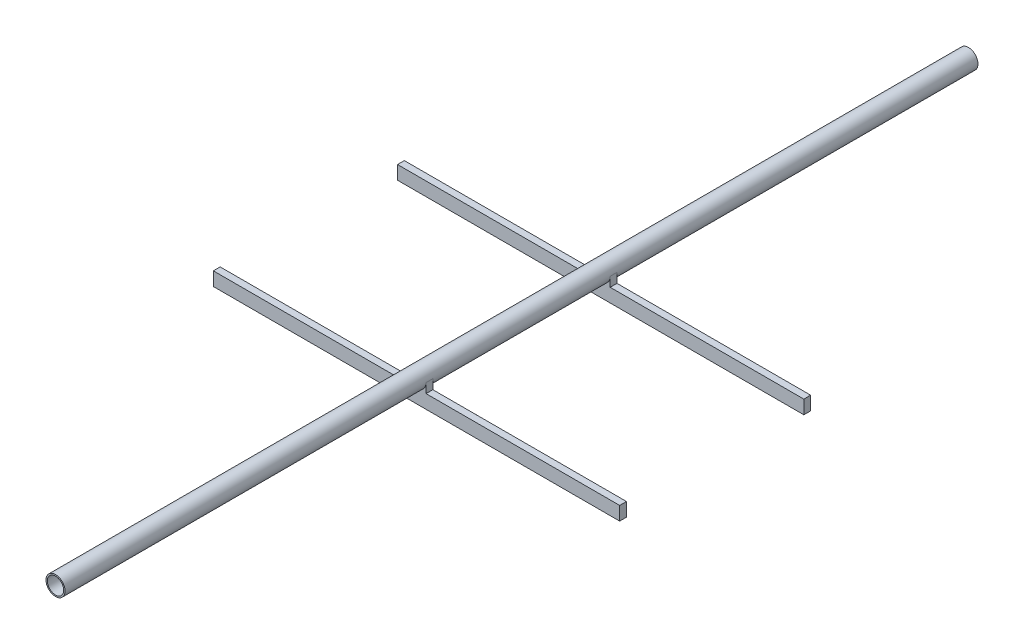
ISO-10303-21;
HEADER;
FILE_DESCRIPTION(('STEP AP214'),'2;1');
FILE_NAME('part.step','',(''),(''),'','','');
FILE_SCHEMA(('AUTOMOTIVE_DESIGN { 1 0 10303 214 1 1 1 1 }'));
ENDSEC;
DATA;
#1=APPLICATION_CONTEXT('core data for automotive mechanical design processes');
#2=APPLICATION_PROTOCOL_DEFINITION('international standard','automotive_design',2000,#1);
#3=PRODUCT_CONTEXT('',#1,'mechanical');
#4=PRODUCT('Part','Part','',(#3));
#5=PRODUCT_RELATED_PRODUCT_CATEGORY('part','',(#4));
#6=PRODUCT_DEFINITION_FORMATION('','',#4);
#7=PRODUCT_DEFINITION_CONTEXT('part definition',#1,'design');
#8=PRODUCT_DEFINITION('design','',#6,#7);
#9=PRODUCT_DEFINITION_SHAPE('','',#8);
#10=(LENGTH_UNIT() NAMED_UNIT(*) SI_UNIT(.MILLI.,.METRE.));
#11=(NAMED_UNIT(*) PLANE_ANGLE_UNIT() SI_UNIT($,.RADIAN.));
#12=(NAMED_UNIT(*) SI_UNIT($,.STERADIAN.) SOLID_ANGLE_UNIT());
#13=UNCERTAINTY_MEASURE_WITH_UNIT(LENGTH_MEASURE(1.E-05),#10,'distance_accuracy_value','');
#14=(GEOMETRIC_REPRESENTATION_CONTEXT(3) GLOBAL_UNCERTAINTY_ASSIGNED_CONTEXT((#13)) GLOBAL_UNIT_ASSIGNED_CONTEXT((#10,
#11,#12)) REPRESENTATION_CONTEXT('',''));
#15=CARTESIAN_POINT('',(0.,0.,0.));
#16=DIRECTION('',(0.,0.,1.));
#17=DIRECTION('',(1.,0.,0.));
#18=AXIS2_PLACEMENT_3D('',#15,#16,#17);
#19=CARTESIAN_POINT('',(0.,0.,-335.28));
#20=DIRECTION('',(0.,0.,1.));
#21=DIRECTION('',(1.,0.,0.));
#22=AXIS2_PLACEMENT_3D('',#19,#20,#21);
#23=CYLINDRICAL_SURFACE('',#22,7.);
#24=CARTESIAN_POINT('',(0.,0.,-335.28));
#25=DIRECTION('',(0.,0.,1.));
#26=DIRECTION('',(1.,0.,0.));
#27=AXIS2_PLACEMENT_3D('',#24,#25,#26);
#28=CIRCLE('',#27,7.);
#29=CARTESIAN_POINT('',(7.,0.,-335.28));
#30=VERTEX_POINT('',#29);
#31=EDGE_CURVE('E11',#30,#30,#28,.T.);
#32=ORIENTED_EDGE('',*,*,#31,.T.);
#33=EDGE_LOOP('',(#32));
#34=FACE_BOUND('',#33,.T.);
#35=CARTESIAN_POINT('',(0.,0.,335.28));
#36=DIRECTION('',(0.,0.,1.));
#37=DIRECTION('',(1.,0.,0.));
#38=AXIS2_PLACEMENT_3D('',#35,#36,#37);
#39=CIRCLE('',#38,7.);
#40=CARTESIAN_POINT('',(7.,0.,335.28));
#41=VERTEX_POINT('',#40);
#42=EDGE_CURVE('E337',#41,#41,#39,.T.);
#43=ORIENTED_EDGE('',*,*,#42,.F.);
#44=EDGE_LOOP('',(#43));
#45=FACE_BOUND('',#44,.T.);
#46=CARTESIAN_POINT('',(0.,0.,-70.13));
#47=DIRECTION('',(0.,0.,1.));
#48=DIRECTION('',(1.,0.,0.));
#49=AXIS2_PLACEMENT_3D('',#46,#47,#48);
#50=CIRCLE('',#49,7.);
#51=CARTESIAN_POINT('',(-7.,0.,-70.13));
#52=VERTEX_POINT('',#51);
#53=CARTESIAN_POINT('',(7.,0.,-70.13));
#54=VERTEX_POINT('',#53);
#55=EDGE_CURVE('E312',#52,#54,#50,.T.);
#56=ORIENTED_EDGE('',*,*,#55,.F.);
#57=DIRECTION('',(0.,0.,1.));
#58=VECTOR('',#57,1.);
#59=CARTESIAN_POINT('',(-7.,0.,-335.28));
#60=LINE('',#59,#58);
#61=CARTESIAN_POINT('',(-7.,0.,-65.13));
#62=VERTEX_POINT('',#61);
#63=EDGE_CURVE('E255',#52,#62,#60,.T.);
#64=ORIENTED_EDGE('',*,*,#63,.T.);
#65=CARTESIAN_POINT('',(0.,0.,-65.13));
#66=DIRECTION('',(0.,0.,-1.));
#67=DIRECTION('',(-1.,0.,0.));
#68=AXIS2_PLACEMENT_3D('',#65,#66,#67);
#69=CIRCLE('',#68,7.);
#70=CARTESIAN_POINT('',(7.,0.,-65.13));
#71=VERTEX_POINT('',#70);
#72=EDGE_CURVE('E318',#71,#62,#69,.T.);
#73=ORIENTED_EDGE('',*,*,#72,.F.);
#74=DIRECTION('',(0.,0.,1.));
#75=VECTOR('',#74,1.);
#76=CARTESIAN_POINT('',(6.99999999999996,0.,-335.28));
#77=LINE('',#76,#75);
#78=EDGE_CURVE('E316',#54,#71,#77,.T.);
#79=ORIENTED_EDGE('',*,*,#78,.F.);
#80=EDGE_LOOP('',(#56,#64,#73,#79));
#81=FACE_BOUND('',#80,.T.);
#82=DIRECTION('',(0.,0.,-1.));
#83=VECTOR('',#82,1.);
#84=CARTESIAN_POINT('',(-7.,0.,335.28));
#85=LINE('',#84,#83);
#86=CARTESIAN_POINT('',(-7.,0.,70.13));
#87=VERTEX_POINT('',#86);
#88=CARTESIAN_POINT('',(-7.,0.,65.13));
#89=VERTEX_POINT('',#88);
#90=EDGE_CURVE('E162',#87,#89,#85,.T.);
#91=ORIENTED_EDGE('',*,*,#90,.F.);
#92=CARTESIAN_POINT('',(0.,0.,70.13));
#93=DIRECTION('',(0.,0.,1.));
#94=DIRECTION('',(1.,0.,0.));
#95=AXIS2_PLACEMENT_3D('',#92,#93,#94);
#96=CIRCLE('',#95,7.);
#97=CARTESIAN_POINT('',(7.00000000000007,0.,70.13));
#98=VERTEX_POINT('',#97);
#99=EDGE_CURVE('E56',#87,#98,#96,.T.);
#100=ORIENTED_EDGE('',*,*,#99,.T.);
#101=DIRECTION('',(0.,0.,-1.));
#102=VECTOR('',#101,1.);
#103=CARTESIAN_POINT('',(6.99999999999996,0.,335.28));
#104=LINE('',#103,#102);
#105=CARTESIAN_POINT('',(7.,0.,65.13));
#106=VERTEX_POINT('',#105);
#107=EDGE_CURVE('E61',#98,#106,#104,.T.);
#108=ORIENTED_EDGE('',*,*,#107,.T.);
#109=CARTESIAN_POINT('',(0.,0.,65.13));
#110=DIRECTION('',(0.,0.,-1.));
#111=DIRECTION('',(-1.,0.,0.));
#112=AXIS2_PLACEMENT_3D('',#109,#110,#111);
#113=CIRCLE('',#112,7.);
#114=EDGE_CURVE('E218',#106,#89,#113,.T.);
#115=ORIENTED_EDGE('',*,*,#114,.T.);
#116=EDGE_LOOP('',(#91,#100,#108,#115));
#117=FACE_BOUND('',#116,.T.);
#118=ADVANCED_FACE('F41',(#34,#45,#81,#117),#23,.T.);
#119=CARTESIAN_POINT('',(0.,-7.,0.));
#120=DIRECTION('',(0.,1.,0.));
#121=DIRECTION('',(0.,0.,1.));
#122=AXIS2_PLACEMENT_3D('',#119,#120,#121);
#123=PLANE('',#122);
#124=DIRECTION('',(1.,0.,0.));
#125=VECTOR('',#124,1.);
#126=CARTESIAN_POINT('',(-149.215,-7.,-65.13));
#127=LINE('',#126,#125);
#128=CARTESIAN_POINT('',(-149.215,-7.,-65.13));
#129=VERTEX_POINT('',#128);
#130=CARTESIAN_POINT('',(-7.,-7.,-65.13));
#131=VERTEX_POINT('',#130);
#132=EDGE_CURVE('E270',#129,#131,#127,.T.);
#133=ORIENTED_EDGE('',*,*,#132,.T.);
#134=DIRECTION('',(0.,0.,1.));
#135=VECTOR('',#134,1.);
#136=CARTESIAN_POINT('',(-7.,-7.,-70.13));
#137=LINE('',#136,#135);
#138=CARTESIAN_POINT('',(-7.00000000000001,-7.,-70.13));
#139=VERTEX_POINT('',#138);
#140=EDGE_CURVE('E251',#139,#131,#137,.T.);
#141=ORIENTED_EDGE('',*,*,#140,.F.);
#142=DIRECTION('',(-1.,0.,0.));
#143=VECTOR('',#142,1.);
#144=CARTESIAN_POINT('',(149.215,-7.,-70.1300000000001));
#145=LINE('',#144,#143);
#146=CARTESIAN_POINT('',(-149.215,-7.,-70.13));
#147=VERTEX_POINT('',#146);
#148=EDGE_CURVE('E286',#139,#147,#145,.T.);
#149=ORIENTED_EDGE('',*,*,#148,.T.);
#150=DIRECTION('',(0.,0.,1.));
#151=VECTOR('',#150,1.);
#152=CARTESIAN_POINT('',(-149.215,-7.,-70.13));
#153=LINE('',#152,#151);
#154=EDGE_CURVE('E290',#147,#129,#153,.T.);
#155=ORIENTED_EDGE('',*,*,#154,.T.);
#156=EDGE_LOOP('',(#133,#141,#149,#155));
#157=FACE_BOUND('',#156,.T.);
#158=ADVANCED_FACE('F367',(#157),#123,.T.);
#159=CARTESIAN_POINT('',(0.,0.,-335.28));
#160=DIRECTION('',(0.,0.,1.));
#161=DIRECTION('',(1.,0.,0.));
#162=AXIS2_PLACEMENT_3D('',#159,#160,#161);
#163=PLANE('',#162);
#164=CARTESIAN_POINT('',(0.,0.,-335.28));
#165=DIRECTION('',(0.,0.,1.));
#166=DIRECTION('',(1.,0.,0.));
#167=AXIS2_PLACEMENT_3D('',#164,#165,#166);
#168=CIRCLE('',#167,6.);
#169=CARTESIAN_POINT('',(6.,0.,-335.28));
#170=VERTEX_POINT('',#169);
#171=EDGE_CURVE('E49',#170,#170,#168,.T.);
#172=ORIENTED_EDGE('',*,*,#171,.T.);
#173=EDGE_LOOP('',(#172));
#174=FACE_BOUND('',#173,.T.);
#175=ORIENTED_EDGE('',*,*,#31,.F.);
#176=EDGE_LOOP('',(#175));
#177=FACE_BOUND('',#176,.T.);
#178=ADVANCED_FACE('F344',(#174,#177),#163,.F.);
#179=CARTESIAN_POINT('',(0.,0.,-335.28));
#180=DIRECTION('',(0.,0.,1.));
#181=DIRECTION('',(1.,0.,0.));
#182=AXIS2_PLACEMENT_3D('',#179,#180,#181);
#183=CYLINDRICAL_SURFACE('',#182,6.);
#184=ORIENTED_EDGE('',*,*,#171,.F.);
#185=EDGE_LOOP('',(#184));
#186=FACE_BOUND('',#185,.T.);
#187=CARTESIAN_POINT('',(0.,0.,335.28));
#188=DIRECTION('',(0.,0.,1.));
#189=DIRECTION('',(1.,0.,0.));
#190=AXIS2_PLACEMENT_3D('',#187,#188,#189);
#191=CIRCLE('',#190,6.);
#192=CARTESIAN_POINT('',(6.,0.,335.28));
#193=VERTEX_POINT('',#192);
#194=EDGE_CURVE('E321',#193,#193,#191,.T.);
#195=ORIENTED_EDGE('',*,*,#194,.T.);
#196=EDGE_LOOP('',(#195));
#197=FACE_BOUND('',#196,.T.);
#198=ADVANCED_FACE('F347',(#186,#197),#183,.F.);
#199=CARTESIAN_POINT('',(0.,0.,335.28));
#200=DIRECTION('',(0.,0.,1.));
#201=DIRECTION('',(1.,0.,0.));
#202=AXIS2_PLACEMENT_3D('',#199,#200,#201);
#203=PLANE('',#202);
#204=ORIENTED_EDGE('',*,*,#42,.T.);
#205=EDGE_LOOP('',(#204));
#206=FACE_BOUND('',#205,.T.);
#207=ORIENTED_EDGE('',*,*,#194,.F.);
#208=EDGE_LOOP('',(#207));
#209=FACE_BOUND('',#208,.T.);
#210=ADVANCED_FACE('F350',(#206,#209),#203,.T.);
#211=CARTESIAN_POINT('',(-7.,7.001,-70.13));
#212=DIRECTION('',(0.,0.,1.));
#213=DIRECTION('',(1.,0.,0.));
#214=AXIS2_PLACEMENT_3D('',#211,#212,#213);
#215=PLANE('',#214);
#216=DIRECTION('',(0.,-1.,0.));
#217=VECTOR('',#216,1.);
#218=CARTESIAN_POINT('',(7.,7.001,-70.13));
#219=LINE('',#218,#217);
#220=CARTESIAN_POINT('',(7.00000000000001,-7.,-70.13));
#221=VERTEX_POINT('',#220);
#222=EDGE_CURVE('E327',#54,#221,#219,.T.);
#223=ORIENTED_EDGE('',*,*,#222,.T.);
#224=CARTESIAN_POINT('',(149.215,-7.,-70.1300000000001));
#225=VERTEX_POINT('',#224);
#226=EDGE_CURVE('E287',#225,#221,#145,.T.);
#227=ORIENTED_EDGE('',*,*,#226,.F.);
#228=DIRECTION('',(0.,1.,0.));
#229=VECTOR('',#228,1.);
#230=CARTESIAN_POINT('',(149.215,-17.,-70.1300000000001));
#231=LINE('',#230,#229);
#232=CARTESIAN_POINT('',(149.215,-17.,-70.1300000000001));
#233=VERTEX_POINT('',#232);
#234=EDGE_CURVE('E282',#233,#225,#231,.T.);
#235=ORIENTED_EDGE('',*,*,#234,.F.);
#236=DIRECTION('',(-1.,0.,0.));
#237=VECTOR('',#236,1.);
#238=CARTESIAN_POINT('',(149.215,-17.,-70.1300000000001));
#239=LINE('',#238,#237);
#240=CARTESIAN_POINT('',(-149.215,-17.,-70.13));
#241=VERTEX_POINT('',#240);
#242=EDGE_CURVE('E269',#233,#241,#239,.T.);
#243=ORIENTED_EDGE('',*,*,#242,.T.);
#244=DIRECTION('',(0.,1.,0.));
#245=VECTOR('',#244,1.);
#246=CARTESIAN_POINT('',(-149.215,-17.,-70.13));
#247=LINE('',#246,#245);
#248=EDGE_CURVE('E306',#241,#147,#247,.T.);
#249=ORIENTED_EDGE('',*,*,#248,.T.);
#250=ORIENTED_EDGE('',*,*,#148,.F.);
#251=DIRECTION('',(0.,-1.,0.));
#252=VECTOR('',#251,1.);
#253=CARTESIAN_POINT('',(-7.,7.001,-70.13));
#254=LINE('',#253,#252);
#255=EDGE_CURVE('E256',#52,#139,#254,.T.);
#256=ORIENTED_EDGE('',*,*,#255,.F.);
#257=ORIENTED_EDGE('',*,*,#55,.T.);
#258=EDGE_LOOP('',(#223,#227,#235,#243,#249,#250,#256,#257));
#259=FACE_BOUND('',#258,.T.);
#260=ADVANCED_FACE('F355',(#259),#215,.F.);
#261=CARTESIAN_POINT('',(7.,7.001,-70.13));
#262=DIRECTION('',(-1.,0.,0.));
#263=DIRECTION('',(0.,0.,1.));
#264=AXIS2_PLACEMENT_3D('',#261,#262,#263);
#265=PLANE('',#264);
#266=ORIENTED_EDGE('',*,*,#222,.F.);
#267=ORIENTED_EDGE('',*,*,#78,.T.);
#268=DIRECTION('',(0.,-1.,0.));
#269=VECTOR('',#268,1.);
#270=CARTESIAN_POINT('',(7.,7.001,-65.13));
#271=LINE('',#270,#269);
#272=CARTESIAN_POINT('',(7.,-7.,-65.13));
#273=VERTEX_POINT('',#272);
#274=EDGE_CURVE('E317',#71,#273,#271,.T.);
#275=ORIENTED_EDGE('',*,*,#274,.T.);
#276=DIRECTION('',(0.,0.,-1.));
#277=VECTOR('',#276,1.);
#278=CARTESIAN_POINT('',(7.,-7.,-70.13));
#279=LINE('',#278,#277);
#280=EDGE_CURVE('E302',#273,#221,#279,.T.);
#281=ORIENTED_EDGE('',*,*,#280,.T.);
#282=EDGE_LOOP('',(#266,#267,#275,#281));
#283=FACE_BOUND('',#282,.T.);
#284=ADVANCED_FACE('F362',(#283),#265,.F.);
#285=CARTESIAN_POINT('',(-7.,7.001,-65.13));
#286=DIRECTION('',(0.,0.,-1.));
#287=DIRECTION('',(-1.,0.,0.));
#288=AXIS2_PLACEMENT_3D('',#285,#286,#287);
#289=PLANE('',#288);
#290=ORIENTED_EDGE('',*,*,#274,.F.);
#291=ORIENTED_EDGE('',*,*,#72,.T.);
#292=DIRECTION('',(0.,-1.,0.));
#293=VECTOR('',#292,1.);
#294=CARTESIAN_POINT('',(-7.,7.001,-65.13));
#295=LINE('',#294,#293);
#296=EDGE_CURVE('E250',#62,#131,#295,.T.);
#297=ORIENTED_EDGE('',*,*,#296,.T.);
#298=ORIENTED_EDGE('',*,*,#132,.F.);
#299=DIRECTION('',(0.,1.,0.));
#300=VECTOR('',#299,1.);
#301=CARTESIAN_POINT('',(-149.215,-17.,-65.13));
#302=LINE('',#301,#300);
#303=CARTESIAN_POINT('',(-149.215,-17.,-65.13));
#304=VERTEX_POINT('',#303);
#305=EDGE_CURVE('E303',#304,#129,#302,.T.);
#306=ORIENTED_EDGE('',*,*,#305,.F.);
#307=DIRECTION('',(1.,0.,0.));
#308=VECTOR('',#307,1.);
#309=CARTESIAN_POINT('',(-149.215,-17.,-65.13));
#310=LINE('',#309,#308);
#311=CARTESIAN_POINT('',(149.215,-17.,-65.1300000000001));
#312=VERTEX_POINT('',#311);
#313=EDGE_CURVE('E278',#304,#312,#310,.T.);
#314=ORIENTED_EDGE('',*,*,#313,.T.);
#315=DIRECTION('',(0.,1.,0.));
#316=VECTOR('',#315,1.);
#317=CARTESIAN_POINT('',(149.215,-17.,-65.1300000000001));
#318=LINE('',#317,#316);
#319=CARTESIAN_POINT('',(149.215,-7.,-65.1300000000001));
#320=VERTEX_POINT('',#319);
#321=EDGE_CURVE('E298',#312,#320,#318,.T.);
#322=ORIENTED_EDGE('',*,*,#321,.T.);
#323=EDGE_CURVE('E294',#273,#320,#127,.T.);
#324=ORIENTED_EDGE('',*,*,#323,.F.);
#325=EDGE_LOOP('',(#290,#291,#297,#298,#306,#314,#322,#324));
#326=FACE_BOUND('',#325,.T.);
#327=ADVANCED_FACE('F392',(#326),#289,.F.);
#328=ORIENTED_EDGE('',*,*,#280,.F.);
#329=ORIENTED_EDGE('',*,*,#323,.T.);
#330=DIRECTION('',(0.,0.,-1.));
#331=VECTOR('',#330,1.);
#332=CARTESIAN_POINT('',(149.215,-7.,-65.1300000000001));
#333=LINE('',#332,#331);
#334=EDGE_CURVE('E260',#320,#225,#333,.T.);
#335=ORIENTED_EDGE('',*,*,#334,.T.);
#336=ORIENTED_EDGE('',*,*,#226,.T.);
#337=EDGE_LOOP('',(#328,#329,#335,#336));
#338=FACE_BOUND('',#337,.T.);
#339=ADVANCED_FACE('F375',(#338),#123,.T.);
#340=CARTESIAN_POINT('',(149.215,-17.,-65.1300000000001));
#341=DIRECTION('',(1.,0.,0.));
#342=DIRECTION('',(0.,0.,-1.));
#343=AXIS2_PLACEMENT_3D('',#340,#341,#342);
#344=PLANE('',#343);
#345=ORIENTED_EDGE('',*,*,#334,.F.);
#346=ORIENTED_EDGE('',*,*,#321,.F.);
#347=DIRECTION('',(0.,0.,-1.));
#348=VECTOR('',#347,1.);
#349=CARTESIAN_POINT('',(149.215,-17.,-65.1300000000001));
#350=LINE('',#349,#348);
#351=EDGE_CURVE('E265',#312,#233,#350,.T.);
#352=ORIENTED_EDGE('',*,*,#351,.T.);
#353=ORIENTED_EDGE('',*,*,#234,.T.);
#354=EDGE_LOOP('',(#345,#346,#352,#353));
#355=FACE_BOUND('',#354,.T.);
#356=ADVANCED_FACE('F400',(#355),#344,.T.);
#357=CARTESIAN_POINT('',(-149.215,-17.,-70.13));
#358=DIRECTION('',(-1.,0.,0.));
#359=DIRECTION('',(0.,0.,1.));
#360=AXIS2_PLACEMENT_3D('',#357,#358,#359);
#361=PLANE('',#360);
#362=ORIENTED_EDGE('',*,*,#154,.F.);
#363=ORIENTED_EDGE('',*,*,#248,.F.);
#364=DIRECTION('',(0.,0.,1.));
#365=VECTOR('',#364,1.);
#366=CARTESIAN_POINT('',(-149.215,-17.,-70.13));
#367=LINE('',#366,#365);
#368=EDGE_CURVE('E274',#241,#304,#367,.T.);
#369=ORIENTED_EDGE('',*,*,#368,.T.);
#370=ORIENTED_EDGE('',*,*,#305,.T.);
#371=EDGE_LOOP('',(#362,#363,#369,#370));
#372=FACE_BOUND('',#371,.T.);
#373=ADVANCED_FACE('F408',(#372),#361,.T.);
#374=CARTESIAN_POINT('',(0.,-17.,0.));
#375=DIRECTION('',(0.,1.,0.));
#376=DIRECTION('',(0.,0.,1.));
#377=AXIS2_PLACEMENT_3D('',#374,#375,#376);
#378=PLANE('',#377);
#379=ORIENTED_EDGE('',*,*,#351,.F.);
#380=ORIENTED_EDGE('',*,*,#313,.F.);
#381=ORIENTED_EDGE('',*,*,#368,.F.);
#382=ORIENTED_EDGE('',*,*,#242,.F.);
#383=EDGE_LOOP('',(#379,#380,#381,#382));
#384=FACE_BOUND('',#383,.T.);
#385=ADVANCED_FACE('F404',(#384),#378,.F.);
#386=CARTESIAN_POINT('',(-7.,7.001,-70.13));
#387=DIRECTION('',(1.,0.,0.));
#388=DIRECTION('',(0.,0.,-1.));
#389=AXIS2_PLACEMENT_3D('',#386,#387,#388);
#390=PLANE('',#389);
#391=ORIENTED_EDGE('',*,*,#63,.F.);
#392=ORIENTED_EDGE('',*,*,#255,.T.);
#393=ORIENTED_EDGE('',*,*,#140,.T.);
#394=ORIENTED_EDGE('',*,*,#296,.F.);
#395=EDGE_LOOP('',(#391,#392,#393,#394));
#396=FACE_BOUND('',#395,.T.);
#397=ADVANCED_FACE('F388',(#396),#390,.F.);
#398=CARTESIAN_POINT('',(0.,-7.,0.));
#399=DIRECTION('',(0.,1.,0.));
#400=DIRECTION('',(0.,0.,-1.));
#401=AXIS2_PLACEMENT_3D('',#398,#399,#400);
#402=PLANE('',#401);
#403=DIRECTION('',(0.,0.,1.));
#404=VECTOR('',#403,1.);
#405=CARTESIAN_POINT('',(7.,-7.,70.13));
#406=LINE('',#405,#404);
#407=CARTESIAN_POINT('',(7.,-7.,65.13));
#408=VERTEX_POINT('',#407);
#409=CARTESIAN_POINT('',(7.00000000000001,-7.,70.13));
#410=VERTEX_POINT('',#409);
#411=EDGE_CURVE('E190',#408,#410,#406,.T.);
#412=ORIENTED_EDGE('',*,*,#411,.T.);
#413=DIRECTION('',(-1.,0.,0.));
#414=VECTOR('',#413,1.);
#415=CARTESIAN_POINT('',(149.215,-7.,70.1300000000001));
#416=LINE('',#415,#414);
#417=CARTESIAN_POINT('',(149.215,-7.,70.1300000000001));
#418=VERTEX_POINT('',#417);
#419=EDGE_CURVE('E179',#418,#410,#416,.T.);
#420=ORIENTED_EDGE('',*,*,#419,.F.);
#421=DIRECTION('',(0.,0.,1.));
#422=VECTOR('',#421,1.);
#423=CARTESIAN_POINT('',(149.215,-7.,65.1300000000001));
#424=LINE('',#423,#422);
#425=CARTESIAN_POINT('',(149.215,-7.,65.1300000000001));
#426=VERTEX_POINT('',#425);
#427=EDGE_CURVE('E246',#426,#418,#424,.T.);
#428=ORIENTED_EDGE('',*,*,#427,.F.);
#429=DIRECTION('',(1.,0.,0.));
#430=VECTOR('',#429,1.);
#431=CARTESIAN_POINT('',(-149.215,-7.,65.13));
#432=LINE('',#431,#430);
#433=EDGE_CURVE('E204',#408,#426,#432,.T.);
#434=ORIENTED_EDGE('',*,*,#433,.F.);
#435=EDGE_LOOP('',(#412,#420,#428,#434));
#436=FACE_BOUND('',#435,.T.);
#437=ADVANCED_FACE('F449',(#436),#402,.T.);
#438=CARTESIAN_POINT('',(149.215,-17.,65.1300000000001));
#439=DIRECTION('',(1.,0.,0.));
#440=DIRECTION('',(0.,0.,1.));
#441=AXIS2_PLACEMENT_3D('',#438,#439,#440);
#442=PLANE('',#441);
#443=ORIENTED_EDGE('',*,*,#427,.T.);
#444=DIRECTION('',(0.,1.,0.));
#445=VECTOR('',#444,1.);
#446=CARTESIAN_POINT('',(149.215,-17.,70.1300000000001));
#447=LINE('',#446,#445);
#448=CARTESIAN_POINT('',(149.215,-17.,70.1300000000001));
#449=VERTEX_POINT('',#448);
#450=EDGE_CURVE('E189',#449,#418,#447,.T.);
#451=ORIENTED_EDGE('',*,*,#450,.F.);
#452=DIRECTION('',(0.,0.,1.));
#453=VECTOR('',#452,1.);
#454=CARTESIAN_POINT('',(149.215,-17.,65.1300000000001));
#455=LINE('',#454,#453);
#456=CARTESIAN_POINT('',(149.215,-17.,65.1300000000001));
#457=VERTEX_POINT('',#456);
#458=EDGE_CURVE('E240',#457,#449,#455,.T.);
#459=ORIENTED_EDGE('',*,*,#458,.F.);
#460=DIRECTION('',(0.,1.,0.));
#461=VECTOR('',#460,1.);
#462=CARTESIAN_POINT('',(149.215,-17.,65.1300000000001));
#463=LINE('',#462,#461);
#464=EDGE_CURVE('E205',#457,#426,#463,.T.);
#465=ORIENTED_EDGE('',*,*,#464,.T.);
#466=EDGE_LOOP('',(#443,#451,#459,#465));
#467=FACE_BOUND('',#466,.T.);
#468=ADVANCED_FACE('F459',(#467),#442,.T.);
#469=CARTESIAN_POINT('',(0.,-17.,0.));
#470=DIRECTION('',(0.,1.,0.));
#471=DIRECTION('',(0.,0.,-1.));
#472=AXIS2_PLACEMENT_3D('',#469,#470,#471);
#473=PLANE('',#472);
#474=ORIENTED_EDGE('',*,*,#458,.T.);
#475=DIRECTION('',(-1.,0.,0.));
#476=VECTOR('',#475,1.);
#477=CARTESIAN_POINT('',(149.215,-17.,70.1300000000001));
#478=LINE('',#477,#476);
#479=CARTESIAN_POINT('',(-149.215,-17.,70.13));
#480=VERTEX_POINT('',#479);
#481=EDGE_CURVE('E183',#449,#480,#478,.T.);
#482=ORIENTED_EDGE('',*,*,#481,.T.);
#483=DIRECTION('',(0.,0.,-1.));
#484=VECTOR('',#483,1.);
#485=CARTESIAN_POINT('',(-149.215,-17.,70.13));
#486=LINE('',#485,#484);
#487=CARTESIAN_POINT('',(-149.215,-17.,65.13));
#488=VERTEX_POINT('',#487);
#489=EDGE_CURVE('E237',#480,#488,#486,.T.);
#490=ORIENTED_EDGE('',*,*,#489,.T.);
#491=DIRECTION('',(1.,0.,0.));
#492=VECTOR('',#491,1.);
#493=CARTESIAN_POINT('',(-149.215,-17.,65.13));
#494=LINE('',#493,#492);
#495=EDGE_CURVE('E208',#488,#457,#494,.T.);
#496=ORIENTED_EDGE('',*,*,#495,.T.);
#497=EDGE_LOOP('',(#474,#482,#490,#496));
#498=FACE_BOUND('',#497,.T.);
#499=ADVANCED_FACE('F466',(#498),#473,.F.);
#500=CARTESIAN_POINT('',(-149.215,-17.,70.13));
#501=DIRECTION('',(-1.,0.,0.));
#502=DIRECTION('',(0.,0.,-1.));
#503=AXIS2_PLACEMENT_3D('',#500,#501,#502);
#504=PLANE('',#503);
#505=DIRECTION('',(0.,0.,-1.));
#506=VECTOR('',#505,1.);
#507=CARTESIAN_POINT('',(-149.215,-7.,70.13));
#508=LINE('',#507,#506);
#509=CARTESIAN_POINT('',(-149.215,-7.,70.13));
#510=VERTEX_POINT('',#509);
#511=CARTESIAN_POINT('',(-149.215,-7.,65.13));
#512=VERTEX_POINT('',#511);
#513=EDGE_CURVE('E175',#510,#512,#508,.T.);
#514=ORIENTED_EDGE('',*,*,#513,.T.);
#515=DIRECTION('',(0.,1.,0.));
#516=VECTOR('',#515,1.);
#517=CARTESIAN_POINT('',(-149.215,-17.,65.13));
#518=LINE('',#517,#516);
#519=EDGE_CURVE('E211',#488,#512,#518,.T.);
#520=ORIENTED_EDGE('',*,*,#519,.F.);
#521=ORIENTED_EDGE('',*,*,#489,.F.);
#522=DIRECTION('',(0.,1.,0.));
#523=VECTOR('',#522,1.);
#524=CARTESIAN_POINT('',(-149.215,-17.,70.13));
#525=LINE('',#524,#523);
#526=EDGE_CURVE('E177',#480,#510,#525,.T.);
#527=ORIENTED_EDGE('',*,*,#526,.T.);
#528=EDGE_LOOP('',(#514,#520,#521,#527));
#529=FACE_BOUND('',#528,.T.);
#530=ADVANCED_FACE('F235',(#529),#504,.T.);
#531=CARTESIAN_POINT('',(-7.,-7.,65.13));
#532=VERTEX_POINT('',#531);
#533=EDGE_CURVE('E215',#512,#532,#432,.T.);
#534=ORIENTED_EDGE('',*,*,#533,.F.);
#535=ORIENTED_EDGE('',*,*,#513,.F.);
#536=CARTESIAN_POINT('',(-7.00000000000001,-7.,70.13));
#537=VERTEX_POINT('',#536);
#538=EDGE_CURVE('E156',#537,#510,#416,.T.);
#539=ORIENTED_EDGE('',*,*,#538,.F.);
#540=DIRECTION('',(0.,0.,-1.));
#541=VECTOR('',#540,1.);
#542=CARTESIAN_POINT('',(-7.,-7.,70.13));
#543=LINE('',#542,#541);
#544=EDGE_CURVE('E161',#537,#532,#543,.T.);
#545=ORIENTED_EDGE('',*,*,#544,.T.);
#546=EDGE_LOOP('',(#534,#535,#539,#545));
#547=FACE_BOUND('',#546,.T.);
#548=ADVANCED_FACE('F173',(#547),#402,.T.);
#549=CARTESIAN_POINT('',(-7.,7.001,70.13));
#550=DIRECTION('',(0.,0.,-1.));
#551=DIRECTION('',(1.,0.,0.));
#552=AXIS2_PLACEMENT_3D('',#549,#550,#551);
#553=PLANE('',#552);
#554=DIRECTION('',(0.,-1.,0.));
#555=VECTOR('',#554,1.);
#556=CARTESIAN_POINT('',(7.,7.001,70.13));
#557=LINE('',#556,#555);
#558=EDGE_CURVE('E199',#98,#410,#557,.T.);
#559=ORIENTED_EDGE('',*,*,#558,.F.);
#560=ORIENTED_EDGE('',*,*,#99,.F.);
#561=DIRECTION('',(0.,-1.,0.));
#562=VECTOR('',#561,1.);
#563=CARTESIAN_POINT('',(-7.,7.001,70.13));
#564=LINE('',#563,#562);
#565=EDGE_CURVE('E152',#87,#537,#564,.T.);
#566=ORIENTED_EDGE('',*,*,#565,.T.);
#567=ORIENTED_EDGE('',*,*,#538,.T.);
#568=ORIENTED_EDGE('',*,*,#526,.F.);
#569=ORIENTED_EDGE('',*,*,#481,.F.);
#570=ORIENTED_EDGE('',*,*,#450,.T.);
#571=ORIENTED_EDGE('',*,*,#419,.T.);
#572=EDGE_LOOP('',(#559,#560,#566,#567,#568,#569,#570,#571));
#573=FACE_BOUND('',#572,.T.);
#574=ADVANCED_FACE('F154',(#573),#553,.F.);
#575=CARTESIAN_POINT('',(7.,7.001,70.13));
#576=DIRECTION('',(-1.,0.,0.));
#577=DIRECTION('',(0.,0.,-1.));
#578=AXIS2_PLACEMENT_3D('',#575,#576,#577);
#579=PLANE('',#578);
#580=ORIENTED_EDGE('',*,*,#558,.T.);
#581=ORIENTED_EDGE('',*,*,#411,.F.);
#582=DIRECTION('',(0.,-1.,0.));
#583=VECTOR('',#582,1.);
#584=CARTESIAN_POINT('',(7.,7.001,65.13));
#585=LINE('',#584,#583);
#586=EDGE_CURVE('E221',#106,#408,#585,.T.);
#587=ORIENTED_EDGE('',*,*,#586,.F.);
#588=ORIENTED_EDGE('',*,*,#107,.F.);
#589=EDGE_LOOP('',(#580,#581,#587,#588));
#590=FACE_BOUND('',#589,.T.);
#591=ADVANCED_FACE('F492',(#590),#579,.F.);
#592=CARTESIAN_POINT('',(-7.,7.001,65.13));
#593=DIRECTION('',(0.,0.,1.));
#594=DIRECTION('',(-1.,0.,0.));
#595=AXIS2_PLACEMENT_3D('',#592,#593,#594);
#596=PLANE('',#595);
#597=ORIENTED_EDGE('',*,*,#586,.T.);
#598=ORIENTED_EDGE('',*,*,#433,.T.);
#599=ORIENTED_EDGE('',*,*,#464,.F.);
#600=ORIENTED_EDGE('',*,*,#495,.F.);
#601=ORIENTED_EDGE('',*,*,#519,.T.);
#602=ORIENTED_EDGE('',*,*,#533,.T.);
#603=DIRECTION('',(0.,-1.,0.));
#604=VECTOR('',#603,1.);
#605=CARTESIAN_POINT('',(-7.,7.001,65.13));
#606=LINE('',#605,#604);
#607=EDGE_CURVE('E167',#89,#532,#606,.T.);
#608=ORIENTED_EDGE('',*,*,#607,.F.);
#609=ORIENTED_EDGE('',*,*,#114,.F.);
#610=EDGE_LOOP('',(#597,#598,#599,#600,#601,#602,#608,#609));
#611=FACE_BOUND('',#610,.T.);
#612=ADVANCED_FACE('F229',(#611),#596,.F.);
#613=CARTESIAN_POINT('',(-7.,7.001,70.13));
#614=DIRECTION('',(1.,0.,0.));
#615=DIRECTION('',(0.,0.,1.));
#616=AXIS2_PLACEMENT_3D('',#613,#614,#615);
#617=PLANE('',#616);
#618=ORIENTED_EDGE('',*,*,#90,.T.);
#619=ORIENTED_EDGE('',*,*,#607,.T.);
#620=ORIENTED_EDGE('',*,*,#544,.F.);
#621=ORIENTED_EDGE('',*,*,#565,.F.);
#622=EDGE_LOOP('',(#618,#619,#620,#621));
#623=FACE_BOUND('',#622,.T.);
#624=ADVANCED_FACE('F165',(#623),#617,.F.);
#625=CLOSED_SHELL('',(#118,#158,#178,#198,#210,#260,#284,#327,#339,#356,#373,#385,#397,#437,
#468,#499,#530,#548,#574,#591,#612,#624));
#626=MANIFOLD_SOLID_BREP('B2',#625);
#627=ADVANCED_BREP_SHAPE_REPRESENTATION('',(#18,#626),#14);
#628=SHAPE_DEFINITION_REPRESENTATION(#9,#627);
ENDSEC;
END-ISO-10303-21;
